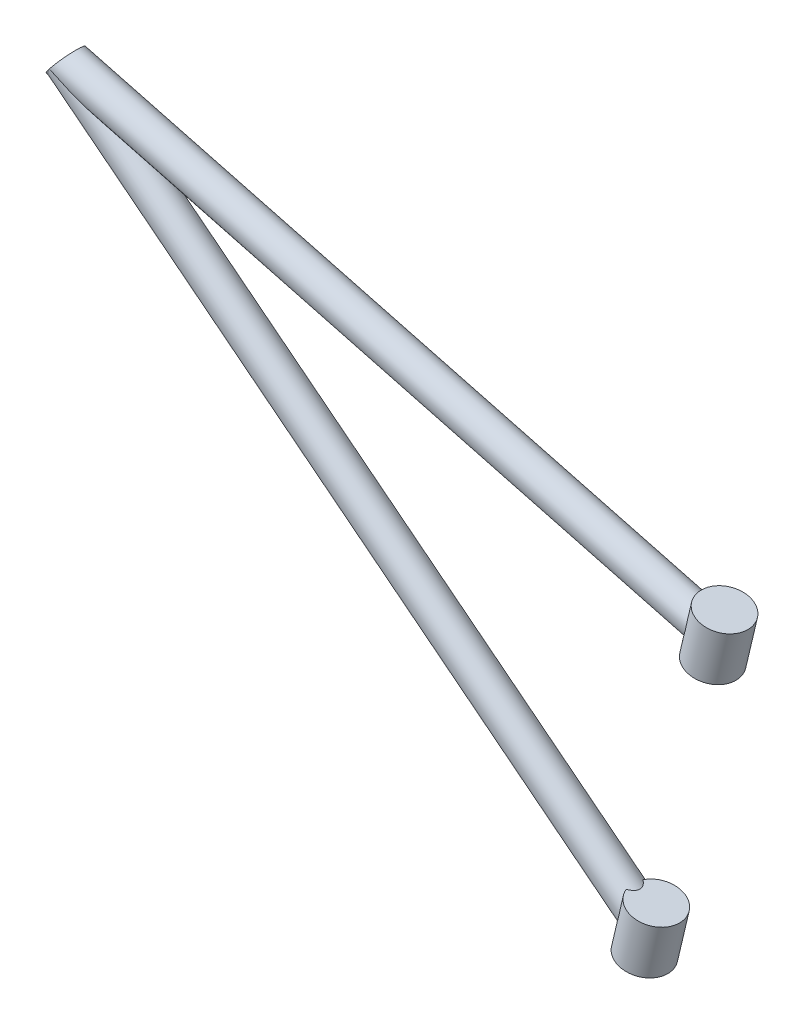
ISO-10303-21;
HEADER;
FILE_DESCRIPTION(('STEP AP214'),'2;1');
FILE_NAME('part.step','',(''),(''),'','','');
FILE_SCHEMA(('AUTOMOTIVE_DESIGN { 1 0 10303 214 1 1 1 1 }'));
ENDSEC;
DATA;
#1=APPLICATION_CONTEXT('core data for automotive mechanical design processes');
#2=APPLICATION_PROTOCOL_DEFINITION('international standard','automotive_design',2000,#1);
#3=PRODUCT_CONTEXT('',#1,'mechanical');
#4=PRODUCT('Part','Part','',(#3));
#5=PRODUCT_RELATED_PRODUCT_CATEGORY('part','',(#4));
#6=PRODUCT_DEFINITION_FORMATION('','',#4);
#7=PRODUCT_DEFINITION_CONTEXT('part definition',#1,'design');
#8=PRODUCT_DEFINITION('design','',#6,#7);
#9=PRODUCT_DEFINITION_SHAPE('','',#8);
#10=(LENGTH_UNIT() NAMED_UNIT(*) SI_UNIT(.MILLI.,.METRE.));
#11=(NAMED_UNIT(*) PLANE_ANGLE_UNIT() SI_UNIT($,.RADIAN.));
#12=(NAMED_UNIT(*) SI_UNIT($,.STERADIAN.) SOLID_ANGLE_UNIT());
#13=UNCERTAINTY_MEASURE_WITH_UNIT(LENGTH_MEASURE(1.E-05),#10,'distance_accuracy_value','');
#14=(GEOMETRIC_REPRESENTATION_CONTEXT(3) GLOBAL_UNCERTAINTY_ASSIGNED_CONTEXT((#13)) GLOBAL_UNIT_ASSIGNED_CONTEXT((#10,
#11,#12)) REPRESENTATION_CONTEXT('',''));
#15=CARTESIAN_POINT('',(0.,0.,0.));
#16=DIRECTION('',(0.,0.,1.));
#17=DIRECTION('',(1.,0.,0.));
#18=AXIS2_PLACEMENT_3D('',#15,#16,#17);
#19=CARTESIAN_POINT('',(-215.,1151.6011,-53.649));
#20=DIRECTION('',(-0.788508643665139,0.615015858971912,-0.00310033520835739));
#21=DIRECTION('',(-0.615018814783549,-0.788512433295911,0.));
#22=AXIS2_PLACEMENT_3D('',#19,#20,#21);
#23=CYLINDRICAL_SURFACE('',#22,9.525);
#24=CARTESIAN_POINT('',(-243.39562055654,1173.74893199642,-53.7606486710474));
#25=DIRECTION('',(0.230684760062267,0.973028498209276,0.000288353283411398));
#26=DIRECTION('',(-0.973022198051878,0.230684316193179,-0.00354236655039736));
#27=AXIS2_PLACEMENT_3D('',#24,#25,#26);
#28=ELLIPSE('',#27,22.8674930535986,9.525);
#29=CARTESIAN_POINT('',(-224.286262085042,1169.21993073521,-58.5827833271125));
#30=VERTEX_POINT('',#29);
#31=CARTESIAN_POINT('',(-224.320634321341,1169.225180437,-48.7995007985225));
#32=VERTEX_POINT('',#31);
#33=EDGE_CURVE('E80',#30,#32,#28,.F.);
#34=ORIENTED_EDGE('',*,*,#33,.F.);
#35=CARTESIAN_POINT('',(-224.320634321341,1169.225180437,-48.7995007985225));
#36=CARTESIAN_POINT('',(-224.295289207423,1169.09059523989,-48.6485355594731));
#37=CARTESIAN_POINT('',(-224.269502594691,1168.95160987775,-48.5016369115154));
#38=CARTESIAN_POINT('',(-224.217460516379,1168.66584174725,-48.2158483730908));
#39=CARTESIAN_POINT('',(-224.191205277724,1168.51906268832,-48.0769547371071));
#40=CARTESIAN_POINT('',(-224.138667081962,1168.21887651433,-47.8071750004393));
#41=CARTESIAN_POINT('',(-224.112384280659,1168.06548298792,-47.6762737035536));
#42=CARTESIAN_POINT('',(-224.060117173359,1167.75254967428,-47.4219621247782));
#43=CARTESIAN_POINT('',(-224.034132907183,1167.59300907918,-47.298552833037));
#44=CARTESIAN_POINT('',(-223.957136973827,1167.10586534488,-46.9390216085571));
#45=CARTESIAN_POINT('',(-223.907125055243,1166.76998067498,-46.713809774104));
#46=CARTESIAN_POINT('',(-223.81276926608,1166.08036007492,-46.2910710180656));
#47=CARTESIAN_POINT('',(-223.768428441769,1165.72661469185,-46.0935589701565));
#48=CARTESIAN_POINT('',(-223.692482337151,1165.03900047878,-45.7430462401006));
#49=CARTESIAN_POINT('',(-223.660064521758,1164.70646741956,-45.5875949874824));
#50=CARTESIAN_POINT('',(-223.605247829181,1164.03125571281,-45.2985848887143));
#51=CARTESIAN_POINT('',(-223.582847710299,1163.68857832828,-45.1650233306261));
#52=CARTESIAN_POINT('',(-223.551264109419,1162.99483116172,-44.9203286610457));
#53=CARTESIAN_POINT('',(-223.542073917122,1162.64376573279,-44.8091841869413));
#54=CARTESIAN_POINT('',(-223.540654640744,1161.93511851939,-44.6105914566239));
#55=CARTESIAN_POINT('',(-223.548419527181,1161.57753909623,-44.5231347890997));
#56=CARTESIAN_POINT('',(-223.591728976539,1160.73355915383,-44.3483048364498));
#57=CARTESIAN_POINT('',(-223.635922136758,1160.2452175784,-44.2713397563707));
#58=CARTESIAN_POINT('',(-223.739698948793,1159.51439261035,-44.1973134032289));
#59=CARTESIAN_POINT('',(-223.780506030959,1159.27120005024,-44.1795398917238));
#60=CARTESIAN_POINT('',(-223.875854045727,1158.78678991507,-44.1590549988136));
#61=CARTESIAN_POINT('',(-223.930395042434,1158.54557234923,-44.1563436877163));
#62=CARTESIAN_POINT('',(-224.054871038112,1158.06405215677,-44.1673837542468));
#63=CARTESIAN_POINT('',(-224.12500107534,1157.82380433931,-44.181354500947));
#64=CARTESIAN_POINT('',(-224.280401330248,1157.34999089194,-44.2273617054836));
#65=CARTESIAN_POINT('',(-224.365670871451,1157.11642496401,-44.2593973562663));
#66=CARTESIAN_POINT('',(-224.550567614918,1156.65864283163,-44.3423936701185));
#67=CARTESIAN_POINT('',(-224.650187433858,1156.43442189516,-44.3933446222576));
#68=CARTESIAN_POINT('',(-224.86212569037,1155.99750936304,-44.5145483765032));
#69=CARTESIAN_POINT('',(-224.974442851189,1155.78481661139,-44.5847992389658));
#70=CARTESIAN_POINT('',(-225.191087424431,1155.40463409945,-44.7320466579948));
#71=CARTESIAN_POINT('',(-225.293959076843,1155.23524453879,-44.80631437343));
#72=CARTESIAN_POINT('',(-225.50528074953,1154.9065164519,-44.9681794158287));
#73=CARTESIAN_POINT('',(-225.613732938815,1154.74718188818,-45.0557819519947));
#74=CARTESIAN_POINT('',(-225.834357534689,1154.43893292305,-45.2438062320331));
#75=CARTESIAN_POINT('',(-225.946531105204,1154.29002182791,-45.3442320151155));
#76=CARTESIAN_POINT('',(-226.172751379729,1154.00271207689,-45.5572829491347));
#77=CARTESIAN_POINT('',(-226.286798308782,1153.8643146954,-45.6699095749595));
#78=CARTESIAN_POINT('',(-226.521059223594,1153.59087193904,-45.912967181198));
#79=CARTESIAN_POINT('',(-226.641280572878,1153.45639033468,-46.0440245602015));
#80=CARTESIAN_POINT('',(-226.880011711337,1153.19866386453,-46.3181683650363));
#81=CARTESIAN_POINT('',(-226.998521482131,1153.07541911934,-46.4612549199345));
#82=CARTESIAN_POINT('',(-227.232179016608,1152.8397918452,-46.7587406524558));
#83=CARTESIAN_POINT('',(-227.347325968949,1152.72741192273,-46.9131425290829));
#84=CARTESIAN_POINT('',(-227.57271586912,1152.51320348435,-47.2324871004078));
#85=CARTESIAN_POINT('',(-227.682958494457,1152.41137566175,-47.3974304865487));
#86=CARTESIAN_POINT('',(-227.91478883551,1152.2020582696,-47.7650609369957));
#87=CARTESIAN_POINT('',(-228.035261038146,1152.0963912512,-47.9694943631884));
#88=CARTESIAN_POINT('',(-228.265752160391,1151.89856614401,-48.3904502736869));
#89=CARTESIAN_POINT('',(-228.375770122552,1151.80640929212,-48.6069738623902));
#90=CARTESIAN_POINT('',(-228.583652833395,1151.63530590534,-49.0509046031115));
#91=CARTESIAN_POINT('',(-228.681513852451,1151.55636342192,-49.2783150656136));
#92=CARTESIAN_POINT('',(-228.863515556458,1151.41154684608,-49.7425923124705));
#93=CARTESIAN_POINT('',(-228.947656277923,1151.3456727189,-49.9794590716571));
#94=CARTESIAN_POINT('',(-229.104160202246,1151.22436656883,-50.4714355906892));
#95=CARTESIAN_POINT('',(-229.175870386422,1151.16949773997,-50.7268927878857));
#96=CARTESIAN_POINT('',(-229.30170568039,1151.07381374639,-51.2446931910341));
#97=CARTESIAN_POINT('',(-229.355830136662,1151.03299910395,-51.507036652501));
#98=CARTESIAN_POINT('',(-229.445529959469,1150.96543066709,-52.0366091980168));
#99=CARTESIAN_POINT('',(-229.481109122684,1150.93867399466,-52.3038372704605));
#100=CARTESIAN_POINT('',(-229.533094783594,1150.89922397472,-52.841176424877));
#101=CARTESIAN_POINT('',(-229.549502067782,1150.88653005032,-53.1112873881254));
#102=CARTESIAN_POINT('',(-229.562602852696,1150.87542087448,-53.6424212189688));
#103=CARTESIAN_POINT('',(-229.55999265743,1150.87650236565,-53.9034167434214));
#104=CARTESIAN_POINT('',(-229.536731293886,1150.89173055095,-54.4242151822462));
#105=CARTESIAN_POINT('',(-229.516080545401,1150.90587694106,-54.6840181242275));
#106=CARTESIAN_POINT('',(-229.457074051506,1150.94722348577,-55.2005289023706));
#107=CARTESIAN_POINT('',(-229.418719841866,1150.97442250805,-55.4572370050269));
#108=CARTESIAN_POINT('',(-229.324926596394,1151.04186428499,-55.9657687486384));
#109=CARTESIAN_POINT('',(-229.269487466396,1151.08210711153,-56.2175923626644));
#110=CARTESIAN_POINT('',(-229.142935316919,1151.17525683397,-56.7125894774502));
#111=CARTESIAN_POINT('',(-229.071954994863,1151.22805682198,-56.9558170972995));
#112=CARTESIAN_POINT('',(-228.915166201555,1151.34653272991,-57.4342155058911));
#113=CARTESIAN_POINT('',(-228.829357822413,1151.41220856983,-57.6693863446706));
#114=CARTESIAN_POINT('',(-228.644188865129,1151.55656830355,-58.1303353799106));
#115=CARTESIAN_POINT('',(-228.544822192596,1151.63525805041,-58.3561092925963));
#116=CARTESIAN_POINT('',(-228.334087726109,1151.80580566917,-58.7968231124242));
#117=CARTESIAN_POINT('',(-228.222719654651,1151.89766384557,-59.0117627688809));
#118=CARTESIAN_POINT('',(-227.985290757245,1152.09856074262,-59.4374765664712));
#119=CARTESIAN_POINT('',(-227.858833402729,1152.20811807729,-59.6477852583267));
#120=CARTESIAN_POINT('',(-227.597000050461,1152.44215985744,-60.054091947955));
#121=CARTESIAN_POINT('',(-227.461623346321,1152.56664548585,-60.2500888096738));
#122=CARTESIAN_POINT('',(-227.184445881784,1152.83104256014,-60.6264138271711));
#123=CARTESIAN_POINT('',(-227.042647077319,1152.97094932768,-60.8067467054395));
#124=CARTESIAN_POINT('',(-226.755363006274,1153.26681642774,-61.1505013351463));
#125=CARTESIAN_POINT('',(-226.609878432523,1153.42277375979,-61.3139262359179));
#126=CARTESIAN_POINT('',(-226.342824344719,1153.72371503972,-61.5966577360825));
#127=CARTESIAN_POINT('',(-226.221339018976,1153.86614781129,-61.7187655348228));
#128=CARTESIAN_POINT('',(-225.979981444149,1154.16271310562,-61.9496161814568));
#129=CARTESIAN_POINT('',(-225.860108896456,1154.31684342644,-62.0583615346306));
#130=CARTESIAN_POINT('',(-225.624229262011,1154.63663394021,-62.2616660803098));
#131=CARTESIAN_POINT('',(-225.508217755384,1154.80228022846,-62.3562419603986));
#132=CARTESIAN_POINT('',(-225.282089586541,1155.14495226779,-62.5307434214336));
#133=CARTESIAN_POINT('',(-225.17197291344,1155.32197799786,-62.6106690294297));
#134=CARTESIAN_POINT('',(-224.959190023712,1155.68761446855,-62.7557996087947));
#135=CARTESIAN_POINT('',(-224.856564468665,1155.87627946014,-62.8209277883119));
#136=CARTESIAN_POINT('',(-224.661237833143,1156.26318881536,-62.9357724147125));
#137=CARTESIAN_POINT('',(-224.568536377274,1156.46143281624,-62.9854894446814));
#138=CARTESIAN_POINT('',(-224.394434085732,1156.86594068026,-63.0696863707433));
#139=CARTESIAN_POINT('',(-224.313032947956,1157.07220432882,-63.1041666742283));
#140=CARTESIAN_POINT('',(-224.162300581922,1157.49097492688,-63.1584073059781));
#141=CARTESIAN_POINT('',(-224.092970598108,1157.70348251746,-63.1781661172562));
#142=CARTESIAN_POINT('',(-223.957854047408,1158.16246560266,-63.2055004800131));
#143=CARTESIAN_POINT('',(-223.893867153004,1158.40959214042,-63.2110259573232));
#144=CARTESIAN_POINT('',(-223.781156826037,1158.90708309515,-63.2054279177171));
#145=CARTESIAN_POINT('',(-223.732435891857,1159.15744803513,-63.1943016773491));
#146=CARTESIAN_POINT('',(-223.648963411181,1159.65993837552,-63.1568028848643));
#147=CARTESIAN_POINT('',(-223.614245946277,1159.91206656964,-63.1303935121607));
#148=CARTESIAN_POINT('',(-223.557424839203,1160.4159253131,-63.0636288551156));
#149=CARTESIAN_POINT('',(-223.535325708187,1160.6676556882,-63.0232685914876));
#150=CARTESIAN_POINT('',(-223.493975928202,1161.29297924496,-62.9067113291572));
#151=CARTESIAN_POINT('',(-223.481481689577,1161.66556564527,-62.8226533010995));
#152=CARTESIAN_POINT('',(-223.475960464991,1162.40411320297,-62.6287679695519));
#153=CARTESIAN_POINT('',(-223.48294217018,1162.77007132916,-62.5189291814144));
#154=CARTESIAN_POINT('',(-223.51200981016,1163.49347214513,-62.2750042212048));
#155=CARTESIAN_POINT('',(-223.534107506928,1163.8509079793,-62.1408992270475));
#156=CARTESIAN_POINT('',(-223.589746146211,1164.55514036599,-61.8491637111948));
#157=CARTESIAN_POINT('',(-223.62328825752,1164.90193582789,-61.6915307875696));
#158=CARTESIAN_POINT('',(-223.702279469123,1165.61509098963,-61.3366418506304));
#159=CARTESIAN_POINT('',(-223.748554703177,1165.98019871388,-61.137048340388));
#160=CARTESIAN_POINT('',(-223.847550102805,1166.69187765871,-60.7087468537214));
#161=CARTESIAN_POINT('',(-223.900266593298,1167.03845928863,-60.4800554761369));
#162=CARTESIAN_POINT('',(-223.981669040053,1167.54070544438,-60.1143525560349));
#163=CARTESIAN_POINT('',(-224.009158447193,1167.70500562439,-59.9888300636568));
#164=CARTESIAN_POINT('',(-224.064536974263,1168.02720420642,-59.7299166212185));
#165=CARTESIAN_POINT('',(-224.092426037216,1168.1851035089,-59.5965267844526));
#166=CARTESIAN_POINT('',(-224.14825641266,1168.49402051598,-59.3213551888889));
#167=CARTESIAN_POINT('',(-224.176197714492,1168.64502338139,-59.179556716037));
#168=CARTESIAN_POINT('',(-224.231658194301,1168.93887124126,-58.8875319299619));
#169=CARTESIAN_POINT('',(-224.259177152742,1169.08171209155,-58.7373014108564));
#170=CARTESIAN_POINT('',(-224.286262085042,1169.21993073521,-58.5827833271127));
#171=B_SPLINE_CURVE_WITH_KNOTS('',3,(#35,#36,#37,#38,#39,#40,#41,#42,#43,#44,#45,#46,#47,#48,
#49,#50,#51,#52,#53,#54,#55,#56,#57,#58,#59,#60,#61,#62,#63,#64,#65,#66,#67,#68,#69,#70,#71,#72,
#73,#74,#75,#76,#77,#78,#79,#80,#81,#82,#83,#84,#85,#86,#87,#88,#89,#90,#91,#92,#93,#94,#95,#96,
#97,#98,#99,#100,#101,#102,#103,#104,#105,#106,#107,#108,#109,#110,#111,#112,#113,#114,#115,
#116,#117,#118,#119,#120,#121,#122,#123,#124,#125,#126,#127,#128,#129,#130,#131,#132,#133,#134,
#135,#136,#137,#138,#139,#140,#141,#142,#143,#144,#145,#146,#147,#148,#149,#150,#151,#152,#153,
#154,#155,#156,#157,#158,#159,#160,#161,#162,#163,#164,#165,#166,#167,#168,#169,#170),
.UNSPECIFIED.,.F.,.F.,(4,2,2,2,2,2,2,2,2,2,2,2,2,2,2,2,2,2,2,2,2,2,2,2,2,2,2,2,2,2,2,2,2,2,2,2,
2,2,2,2,2,2,2,2,2,2,2,2,2,2,2,2,2,2,2,2,2,2,2,2,2,2,2,2,2,2,2,4),(0.,0.611321113095376,
1.22235382943905,1.83218605530833,2.44209870234837,3.66289333627039,4.88434099855855,
5.98894252437587,7.09340709627885,8.19731043031255,9.3008212635092,10.7844934193154,
11.5255072719039,12.2665245834172,13.0173945439191,13.768230961792,14.5186824394653,
15.2690585242177,15.9032452299517,16.5376803173906,17.1723157415739,17.8070279688856,
18.4752867183987,19.1435526389086,19.8119784806388,20.4804482111198,21.258843318667,
22.0373096468022,22.8160142137426,23.5947167082833,24.4065344178047,25.2183822925516,
26.0300638965936,26.8417122016529,27.6237962912563,28.4058621827748,29.187860243073,
29.9698626134919,30.7454316380735,31.5209958450602,32.2969098201376,33.0728417402573,
33.8781372588605,34.68349663142,35.48861234955,36.2935778332745,36.9634458938148,
37.6331881707952,38.3021353757178,38.9710813454979,39.6434233396011,40.3157398923393,
40.9880384679274,41.6604063114264,42.4252747618273,43.1902683230497,43.9571126486431,
44.7242309558051,45.8689446439775,47.0141692429462,48.1602859732013,49.3065197888623,
50.5611680159512,51.8151037127785,52.4406454213905,53.066098822063,53.6928400783569,
54.319896778774),.UNSPECIFIED.);
#172=EDGE_CURVE('E86',#32,#30,#171,.T.);
#173=ORIENTED_EDGE('',*,*,#172,.F.);
#174=EDGE_LOOP('',(#34,#173));
#175=FACE_BOUND('',#174,.T.);
#176=CARTESIAN_POINT('',(-558.599999999999,1419.6,-55.));
#177=DIRECTION('',(-0.897008226583714,0.442000857679935,-0.00338869463695132));
#178=DIRECTION('',(0.441999884452041,0.897014466927656,0.00107157215105032));
#179=AXIS2_PLACEMENT_3D('',#176,#177,#178);
#180=ELLIPSE('',#179,9.72785711197768,9.525);
#181=CARTESIAN_POINT('',(-558.566535399132,1419.59488894593,-64.5249398422045));
#182=VERTEX_POINT('',#181);
#183=CARTESIAN_POINT('',(-558.633464600869,1419.60511105407,-45.4750601577955));
#184=VERTEX_POINT('',#183);
#185=EDGE_CURVE('E93',#182,#184,#180,.T.);
#186=ORIENTED_EDGE('',*,*,#185,.F.);
#187=CARTESIAN_POINT('',(-558.599999999999,1419.6,-55.));
#188=DIRECTION('',(0.441999884452041,0.897014466927656,0.00107157215105032));
#189=DIRECTION('',(-0.897008226583714,0.442000857679935,-0.00338869463695132));
#190=AXIS2_PLACEMENT_3D('',#187,#188,#189);
#191=ELLIPSE('',#190,46.8855974220386,9.525);
#192=EDGE_CURVE('E119',#184,#182,#191,.T.);
#193=ORIENTED_EDGE('',*,*,#192,.F.);
#194=EDGE_LOOP('',(#186,#193));
#195=FACE_BOUND('',#194,.T.);
#196=ADVANCED_FACE('F67',(#175,#195),#23,.T.);
#197=CARTESIAN_POINT('',(-175.,1320.3211,-53.599));
#198=DIRECTION('',(-0.968096795715719,0.250551577091192,-0.00353572369863849));
#199=DIRECTION('',(-0.250553143221362,-0.968102847027058,0.));
#200=AXIS2_PLACEMENT_3D('',#197,#198,#199);
#201=CYLINDRICAL_SURFACE('',#200,9.525);
#202=CARTESIAN_POINT('',(-190.753939195461,1314.55952101737,-53.6478210535175));
#203=CARTESIAN_POINT('',(-190.753173276137,1314.55932352662,-53.8874819712135));
#204=CARTESIAN_POINT('',(-190.744347125622,1314.56639484963,-54.127133975741));
#205=CARTESIAN_POINT('',(-190.71075571716,1314.59498073899,-54.6044527277699));
#206=CARTESIAN_POINT('',(-190.685989540937,1314.61649613745,-54.8421193600982));
#207=CARTESIAN_POINT('',(-190.621032728392,1314.67370023612,-55.3137218601182));
#208=CARTESIAN_POINT('',(-190.580834245694,1314.70939614656,-55.547655766826));
#209=CARTESIAN_POINT('',(-190.48584676052,1314.79452200271,-56.0099791079303));
#210=CARTESIAN_POINT('',(-190.431057771031,1314.8439519362,-56.2383685472621));
#211=CARTESIAN_POINT('',(-190.308254983543,1314.95573315487,-56.6870713684654));
#212=CARTESIAN_POINT('',(-190.24030531069,1315.01802187907,-56.9074179891311));
#213=CARTESIAN_POINT('',(-190.092242541731,1315.1550712723,-57.3399734740079));
#214=CARTESIAN_POINT('',(-190.012129472565,1315.22983191371,-57.5521823562414));
#215=CARTESIAN_POINT('',(-189.84108895378,1315.39121656418,-57.9674608202499));
#216=CARTESIAN_POINT('',(-189.750163613113,1315.47783826022,-58.1705321736977));
#217=CARTESIAN_POINT('',(-189.558844298662,1315.66243521111,-58.5668985191001));
#218=CARTESIAN_POINT('',(-189.458446804482,1315.76041469027,-58.7601898349033));
#219=CARTESIAN_POINT('',(-189.240922696546,1315.97584539456,-59.1520214270591));
#220=CARTESIAN_POINT('',(-189.123099194351,1316.09423887925,-59.3496565831249));
#221=CARTESIAN_POINT('',(-188.879812171168,1316.34332315267,-59.7321832057202));
#222=CARTESIAN_POINT('',(-188.754345350303,1316.47401926633,-59.9170690934688));
#223=CARTESIAN_POINT('',(-188.497479795171,1316.74752979453,-60.2737962759467));
#224=CARTESIAN_POINT('',(-188.366072973456,1316.89036097895,-60.4456188761465));
#225=CARTESIAN_POINT('',(-188.099439552992,1317.18775611879,-60.7754449671732));
#226=CARTESIAN_POINT('',(-187.964214216859,1317.34231622385,-60.9334529567109));
#227=CARTESIAN_POINT('',(-187.670667191836,1317.68818460187,-61.2587751225514));
#228=CARTESIAN_POINT('',(-187.512026137735,1317.88146851752,-61.4237108335926));
#229=CARTESIAN_POINT('',(-187.195476461372,1318.28397071489,-61.7338255596395));
#230=CARTESIAN_POINT('',(-187.037568021286,1318.49319275592,-61.8789998908875));
#231=CARTESIAN_POINT('',(-186.726467155519,1318.92743566851,-62.148229603562));
#232=CARTESIAN_POINT('',(-186.573266845149,1319.15242779309,-62.2723220696339));
#233=CARTESIAN_POINT('',(-186.27538978657,1319.61876958345,-62.4983197574415));
#234=CARTESIAN_POINT('',(-186.130713066173,1319.8601193026,-62.600224906784));
#235=CARTESIAN_POINT('',(-185.8961508264,1320.28357772402,-62.7530015433697));
#236=CARTESIAN_POINT('',(-185.802890326575,1320.46162664385,-62.8099984758332));
#237=CARTESIAN_POINT('',(-185.624452256442,1320.82503024277,-62.9116802923861));
#238=CARTESIAN_POINT('',(-185.539269476336,1321.01038010234,-62.9563731479945));
#239=CARTESIAN_POINT('',(-185.378603479192,1321.38753946652,-63.0328474108784));
#240=CARTESIAN_POINT('',(-185.303107246393,1321.57933985649,-63.0646462706239));
#241=CARTESIAN_POINT('',(-185.163043472864,1321.96861509383,-63.1149416436986));
#242=CARTESIAN_POINT('',(-185.09847605389,1322.16609000438,-63.1334380088355));
#243=CARTESIAN_POINT('',(-184.981065993868,1322.56611441825,-63.1568806882635));
#244=CARTESIAN_POINT('',(-184.928268998185,1322.76868039991,-63.1617750672427));
#245=CARTESIAN_POINT('',(-184.835256243172,1323.17653970493,-63.1578218281094));
#246=CARTESIAN_POINT('',(-184.795040260688,1323.38183297984,-63.148974453756));
#247=CARTESIAN_POINT('',(-184.727144716963,1323.79366202198,-63.1177400358333));
#248=CARTESIAN_POINT('',(-184.69947794484,1324.00019884036,-63.0953392337324));
#249=CARTESIAN_POINT('',(-184.656210799934,1324.41270806028,-63.0374228992829));
#250=CARTESIAN_POINT('',(-184.640612905695,1324.61868033724,-63.0019046752663));
#251=CARTESIAN_POINT('',(-184.618751170142,1325.06579843923,-62.9107435297436));
#252=CARTESIAN_POINT('',(-184.614693912215,1325.3065467072,-62.8526186902304));
#253=CARTESIAN_POINT('',(-184.620178123392,1325.78329016911,-62.7199128906776));
#254=CARTESIAN_POINT('',(-184.629722539503,1326.01928432177,-62.6453283673611));
#255=CARTESIAN_POINT('',(-184.660255999537,1326.48527926654,-62.4806248191313));
#256=CARTESIAN_POINT('',(-184.681257098936,1326.71527347752,-62.3904894990802));
#257=CARTESIAN_POINT('',(-184.732559890817,1327.16784350322,-62.1956367216974));
#258=CARTESIAN_POINT('',(-184.762861319196,1327.39041952841,-62.0909196784936));
#259=CARTESIAN_POINT('',(-184.865911822417,1328.05385985535,-61.7518083902875));
#260=CARTESIAN_POINT('',(-184.950111250602,1328.48194494949,-61.4954738528022));
#261=CARTESIAN_POINT('',(-185.133822788399,1329.29758942415,-60.9292388650454));
#262=CARTESIAN_POINT('',(-185.233342425093,1329.68512872577,-60.6193120747022));
#263=CARTESIAN_POINT('',(-185.396286649879,1330.27137728801,-60.0788218089472));
#264=CARTESIAN_POINT('',(-185.458754556981,1330.4850666954,-59.8640425597593));
#265=CARTESIAN_POINT('',(-185.582426558913,1330.89268542503,-59.4159634068953));
#266=CARTESIAN_POINT('',(-185.643630396179,1331.08661075126,-59.1826597747452));
#267=CARTESIAN_POINT('',(-185.762335459443,1331.45218421076,-58.6986784073366));
#268=CARTESIAN_POINT('',(-185.819840326108,1331.62385442277,-58.4480182757927));
#269=CARTESIAN_POINT('',(-185.928984648582,1331.94260903194,-57.9303515724569));
#270=CARTESIAN_POINT('',(-185.980626347743,1332.08970284269,-57.6633513132824));
#271=CARTESIAN_POINT('',(-186.064147843548,1332.32356572651,-57.1828384878096));
#272=CARTESIAN_POINT('',(-186.097752101616,1332.41624778731,-56.9724868639357));
#273=CARTESIAN_POINT('',(-186.159676195115,1332.58513618912,-56.5445323049793));
#274=CARTESIAN_POINT('',(-186.187997152762,1332.66134602951,-56.3269309214038));
#275=CARTESIAN_POINT('',(-186.238627519419,1332.79622533821,-55.8858360715992));
#276=CARTESIAN_POINT('',(-186.260941253334,1332.85490742899,-55.662346972188));
#277=CARTESIAN_POINT('',(-186.299000364562,1332.95393421736,-55.2107718407871));
#278=CARTESIAN_POINT('',(-186.314745578389,1332.99427845854,-54.9826856945277));
#279=CARTESIAN_POINT('',(-186.339285132057,1333.05608805207,-54.5227632708627));
#280=CARTESIAN_POINT('',(-186.348054615067,1333.07748592261,-54.2909165601384));
#281=CARTESIAN_POINT('',(-186.358312459469,1333.10079576062,-53.82608160722));
#282=CARTESIAN_POINT('',(-186.359800830609,1333.10270775418,-53.593093366555));
#283=CARTESIAN_POINT('',(-186.355470246828,1333.08701359718,-53.1278233888262));
#284=CARTESIAN_POINT('',(-186.349650556795,1333.06940548314,-52.8955417251923));
#285=CARTESIAN_POINT('',(-186.33088876191,1333.01496921863,-52.4335435709002));
#286=CARTESIAN_POINT('',(-186.31794682275,1332.97814151529,-52.2038270206933));
#287=CARTESIAN_POINT('',(-186.286194495221,1332.88832829191,-51.760774671337));
#288=CARTESIAN_POINT('',(-186.267732647408,1332.83630579613,-51.5472172471947));
#289=CARTESIAN_POINT('',(-186.225230658051,1332.71626929353,-51.1251439688765));
#290=CARTESIAN_POINT('',(-186.201188587855,1332.64824975766,-50.9166298853708));
#291=CARTESIAN_POINT('',(-186.14811517242,1332.49710320011,-50.5058861719436));
#292=CARTESIAN_POINT('',(-186.119085164448,1332.41398022732,-50.3036548747222));
#293=CARTESIAN_POINT('',(-186.056683514999,1332.23351841698,-49.9062611522535));
#294=CARTESIAN_POINT('',(-186.023310282131,1332.1361743671,-49.7111013517311));
#295=CARTESIAN_POINT('',(-185.94999474642,1331.91950850595,-49.31256926022));
#296=CARTESIAN_POINT('',(-185.90973605236,1331.79902700764,-49.1098859830114));
#297=CARTESIAN_POINT('',(-185.825943032636,1331.54367220568,-48.7144141817806));
#298=CARTESIAN_POINT('',(-185.782407331804,1331.40879285005,-48.5216298695031));
#299=CARTESIAN_POINT('',(-185.693090061034,1331.12577289579,-48.1465066033552));
#300=CARTESIAN_POINT('',(-185.647307670951,1330.9776274379,-47.9641715173833));
#301=CARTESIAN_POINT('',(-185.554587160773,1330.66915883348,-47.6104135050218));
#302=CARTESIAN_POINT('',(-185.507648909479,1330.50883430017,-47.4389918253873));
#303=CARTESIAN_POINT('',(-185.405529917009,1330.14791834102,-47.0783761657935));
#304=CARTESIAN_POINT('',(-185.350343687659,1329.94518910973,-46.8913190550529));
#305=CARTESIAN_POINT('',(-185.241881973975,1329.52557208121,-46.5331748294722));
#306=CARTESIAN_POINT('',(-185.188606785969,1329.30868210278,-46.3620901848025));
#307=CARTESIAN_POINT('',(-185.086072541563,1328.86182620662,-46.0363044005713));
#308=CARTESIAN_POINT('',(-185.036815828541,1328.63185279007,-45.8816128051318));
#309=CARTESIAN_POINT('',(-184.944722130874,1328.16006584648,-45.5893457115036));
#310=CARTESIAN_POINT('',(-184.901884218953,1327.91825403634,-45.4517677415229));
#311=CARTESIAN_POINT('',(-184.830045775968,1327.4547018407,-45.2105447246641));
#312=CARTESIAN_POINT('',(-184.799986241843,1327.23421384418,-45.1048075479443));
#313=CARTESIAN_POINT('',(-184.748774030131,1326.78584712572,-44.9077432078227));
#314=CARTESIAN_POINT('',(-184.727621306168,1326.55796844227,-44.8164159693926));
#315=CARTESIAN_POINT('',(-184.696347198844,1326.09626942506,-44.6491714394377));
#316=CARTESIAN_POINT('',(-184.68620802866,1325.86245929749,-44.573229462681));
#317=CARTESIAN_POINT('',(-184.67903132957,1325.38996819197,-44.4375771914747));
#318=CARTESIAN_POINT('',(-184.681990869216,1325.15128831575,-44.3778632684163));
#319=CARTESIAN_POINT('',(-184.701113937431,1324.71315583905,-44.2846885314263));
#320=CARTESIAN_POINT('',(-184.714864220245,1324.51418526346,-44.2484577267921));
#321=CARTESIAN_POINT('',(-184.753454086789,1324.11547586847,-44.1882676646681));
#322=CARTESIAN_POINT('',(-184.778291442209,1323.91573721144,-44.1643059433826));
#323=CARTESIAN_POINT('',(-184.839575239762,1323.51707439087,-44.1290913982558));
#324=CARTESIAN_POINT('',(-184.876012305947,1323.3181497005,-44.1178283434682));
#325=CARTESIAN_POINT('',(-184.960610702788,1322.92248327026,-44.1082216390922));
#326=CARTESIAN_POINT('',(-185.0087722333,1322.72574156767,-44.1098782097471));
#327=CARTESIAN_POINT('',(-185.116448777112,1322.3359358264,-44.1261293389288));
#328=CARTESIAN_POINT('',(-185.175963949373,1322.14287183925,-44.1407240786109));
#329=CARTESIAN_POINT('',(-185.305526466112,1321.76174113289,-44.1826384041491));
#330=CARTESIAN_POINT('',(-185.375573741006,1321.57367438066,-44.2099579059361));
#331=CARTESIAN_POINT('',(-185.525107495252,1321.20339231672,-44.2769538630643));
#332=CARTESIAN_POINT('',(-185.60460312216,1321.02118289626,-44.3166423549069));
#333=CARTESIAN_POINT('',(-185.771633917045,1320.66344516805,-44.4078651697605));
#334=CARTESIAN_POINT('',(-185.859173660085,1320.48792074366,-44.4594062592457));
#335=CARTESIAN_POINT('',(-186.067552294938,1320.09342535133,-44.5906059998254));
#336=CARTESIAN_POINT('',(-186.190604764323,1319.87688487849,-44.6740750180193));
#337=CARTESIAN_POINT('',(-186.444530514028,1319.45626849778,-44.858702392554));
#338=CARTESIAN_POINT('',(-186.575406603965,1319.25219712167,-44.9598671292057));
#339=CARTESIAN_POINT('',(-186.84216519874,1318.85635167945,-45.1789295170187));
#340=CARTESIAN_POINT('',(-186.978053010163,1318.6645912736,-45.2968453046592));
#341=CARTESIAN_POINT('',(-187.252036303826,1318.29345418746,-45.5484468412848));
#342=CARTESIAN_POINT('',(-187.390131649517,1318.11407674484,-45.6821316181053));
#343=CARTESIAN_POINT('',(-187.668826468743,1317.76414398747,-45.9673274821298));
#344=CARTESIAN_POINT('',(-187.809422639033,1317.5938268329,-46.119133685765));
#345=CARTESIAN_POINT('',(-188.088158414499,1317.26570662138,-46.4378804637019));
#346=CARTESIAN_POINT('',(-188.226297392594,1317.10790672432,-46.6048248368548));
#347=CARTESIAN_POINT('',(-188.497931510532,1316.80490108163,-46.9533357011089));
#348=CARTESIAN_POINT('',(-188.631426199408,1316.65969655701,-47.13490360653));
#349=CARTESIAN_POINT('',(-188.891690618255,1316.38211379078,-47.5121778541811));
#350=CARTESIAN_POINT('',(-189.018459351595,1316.24973744763,-47.7078862816179));
#351=CARTESIAN_POINT('',(-189.279745979003,1315.98125583595,-48.1402327111003));
#352=CARTESIAN_POINT('',(-189.413000394817,1315.84705882036,-48.3788297547625));
#353=CARTESIAN_POINT('',(-189.665179366286,1315.59667697649,-48.8723600257526));
#354=CARTESIAN_POINT('',(-189.784110343366,1315.48048406993,-49.1272858535176));
#355=CARTESIAN_POINT('',(-190.004688346199,1315.26725911924,-49.6518284776941));
#356=CARTESIAN_POINT('',(-190.106355604091,1315.17020462412,-49.9214275813983));
#357=CARTESIAN_POINT('',(-190.289791434439,1314.99633830584,-50.473574235218));
#358=CARTESIAN_POINT('',(-190.371568114587,1314.91951823377,-50.7561164535332));
#359=CARTESIAN_POINT('',(-190.493594140676,1314.80528196961,-51.2532766092158));
#360=CARTESIAN_POINT('',(-190.53908902951,1314.7628311576,-51.4654743048959));
#361=CARTESIAN_POINT('',(-190.617480225738,1314.68968177169,-51.8941629273531));
#362=CARTESIAN_POINT('',(-190.650379035156,1314.65898086384,-52.1106529925198));
#363=CARTESIAN_POINT('',(-190.702969572811,1314.60966175048,-52.546501385509));
#364=CARTESIAN_POINT('',(-190.722667061322,1314.59103827521,-52.7658584197033));
#365=CARTESIAN_POINT('',(-190.748505451264,1314.56605831575,-53.2060864141235));
#366=CARTESIAN_POINT('',(-190.754645041248,1314.55970301827,-53.4269575187319));
#367=CARTESIAN_POINT('',(-190.753939195461,1314.55952101737,-53.6478210535175));
#368=B_SPLINE_CURVE_WITH_KNOTS('',3,(#202,#203,#204,#205,#206,#207,#208,#209,#210,#211,#212,
#213,#214,#215,#216,#217,#218,#219,#220,#221,#222,#223,#224,#225,#226,#227,#228,#229,#230,#231,
#232,#233,#234,#235,#236,#237,#238,#239,#240,#241,#242,#243,#244,#245,#246,#247,#248,#249,#250,
#251,#252,#253,#254,#255,#256,#257,#258,#259,#260,#261,#262,#263,#264,#265,#266,#267,#268,#269,
#270,#271,#272,#273,#274,#275,#276,#277,#278,#279,#280,#281,#282,#283,#284,#285,#286,#287,#288,
#289,#290,#291,#292,#293,#294,#295,#296,#297,#298,#299,#300,#301,#302,#303,#304,#305,#306,#307,
#308,#309,#310,#311,#312,#313,#314,#315,#316,#317,#318,#319,#320,#321,#322,#323,#324,#325,#326,
#327,#328,#329,#330,#331,#332,#333,#334,#335,#336,#337,#338,#339,#340,#341,#342,#343,#344,#345,
#346,#347,#348,#349,#350,#351,#352,#353,#354,#355,#356,#357,#358,#359,#360,#361,#362,#363,#364,
#365,#366,#367),.UNSPECIFIED.,.T.,.F.,(4,2,2,2,2,2,2,2,2,2,2,2,2,2,2,2,2,2,2,2,2,2,2,2,2,2,2,2,
2,2,2,2,2,2,2,2,2,2,2,2,2,2,2,2,2,2,2,2,2,2,2,2,2,2,2,2,2,2,2,2,2,2,2,2,2,2,2,2,2,2,2,2,2,2,2,2,
2,2,2,2,2,2,4),(0.,0.718761889194264,1.43756518875109,2.15673444055629,2.87590305219343,
3.59165189138774,4.30739914533746,5.02300701994356,5.73888191110378,6.51441922460631,
7.29029376944305,8.06725852709305,8.84396931732261,9.74155422161301,10.639351498581,
11.5355527495362,12.4317569245883,13.0579455386586,13.6837275001299,14.3086595937207,
14.9335986490664,15.5609205993016,16.1882314218648,16.8161801192703,17.4442577421181,
18.1862737774696,18.928450606119,19.6714099126252,20.4143481230415,21.9270801279758,
23.4405577502841,24.3675621714748,25.2947536497084,26.2210181283394,27.1469269985311,
27.8431599710917,28.5392448893626,29.2348273125878,29.930427047431,30.628494467083,
31.3265609519557,32.0246976601979,32.7228181275145,33.3838265046773,34.0450636825419,
34.7061238585141,35.3674269376293,36.084328300426,36.8015322001708,37.5189998886248,
38.2365493945451,39.0796230280813,39.9228268292241,40.7665188818787,41.6100889347411,
42.3485686025597,43.0870444252105,43.8243258324591,44.561442246966,45.1689467891595,
45.7763292884442,46.3832220868541,46.9901252311094,47.5970368731232,48.203944505494,
48.8114445852049,49.4192923425664,50.2061738259689,50.9933396118333,51.7813642567751,
52.5693403450419,53.3725782163624,54.176018217174,54.9795360164806,55.7831725478809,
56.6952773903345,57.6069717875684,58.517590242,59.4278368905536,60.0905809167669,
60.7531932303764,61.4155162306405,62.0779032941745),.UNSPECIFIED.);
#369=CARTESIAN_POINT('',(-190.753939195461,1314.55952101737,-53.6478210535175));
#370=VERTEX_POINT('',#369);
#371=EDGE_CURVE('E12',#370,#370,#368,.T.);
#372=ORIENTED_EDGE('',*,*,#371,.F.);
#373=EDGE_LOOP('',(#372));
#374=FACE_BOUND('',#373,.T.);
#375=CARTESIAN_POINT('',(-558.600000000001,1419.6,-55.));
#376=DIRECTION('',(-0.788508643665139,0.615015858971912,-0.00310033520835738));
#377=DIRECTION('',(-0.615013638287672,-0.788514556162628,-0.00173765353659148));
#378=AXIS2_PLACEMENT_3D('',#375,#376,#377);
#379=ELLIPSE('',#378,10.38195969076,9.525);
#380=EDGE_CURVE('E112',#182,#184,#379,.F.);
#381=ORIENTED_EDGE('',*,*,#380,.T.);
#382=ORIENTED_EDGE('',*,*,#192,.T.);
#383=EDGE_LOOP('',(#381,#382));
#384=FACE_BOUND('',#383,.T.);
#385=ADVANCED_FACE('F139',(#374,#384),#201,.T.);
#386=EDGE_CURVE('E108',#184,#182,#379,.F.);
#387=ORIENTED_EDGE('',*,*,#386,.T.);
#388=ORIENTED_EDGE('',*,*,#185,.T.);
#389=EDGE_LOOP('',(#387,#388));
#390=FACE_BOUND('',#389,.T.);
#391=ADVANCED_FACE('F142',(#390),#201,.T.);
#392=CARTESIAN_POINT('',(-558.6,1419.6,-55.));
#393=DIRECTION('',(-0.788508643665139,0.615015858971912,-0.00310033520835738));
#394=DIRECTION('',(-0.615018814783548,-0.788512433295912,0.));
#395=AXIS2_PLACEMENT_3D('',#392,#393,#394);
#396=PLANE('',#395);
#397=ORIENTED_EDGE('',*,*,#386,.F.);
#398=ORIENTED_EDGE('',*,*,#380,.F.);
#399=EDGE_LOOP('',(#397,#398));
#400=FACE_BOUND('',#399,.T.);
#401=ADVANCED_FACE('F69',(#400),#396,.T.);
#402=CARTESIAN_POINT('',(-218.460272,1137.00567,-53.6533253));
#403=DIRECTION('',(0.230684760062267,0.973028498209276,0.000288353283411398));
#404=DIRECTION('',(-0.973028538661778,0.230684769652712,0.));
#405=AXIS2_PLACEMENT_3D('',#402,#403,#404);
#406=PLANE('',#405);
#407=CARTESIAN_POINT('',(-218.460272,1137.00567,-53.6533253));
#408=DIRECTION('',(0.230684760062267,0.973028498209276,0.000288353283411398));
#409=DIRECTION('',(-0.973028538661778,0.230684769652712,0.));
#410=AXIS2_PLACEMENT_3D('',#407,#408,#409);
#411=CIRCLE('',#410,14.);
#412=CARTESIAN_POINT('',(-232.082671541265,1140.23525677514,-53.6533253));
#413=VERTEX_POINT('',#412);
#414=EDGE_CURVE('E109',#413,#413,#411,.T.);
#415=ORIENTED_EDGE('',*,*,#414,.F.);
#416=EDGE_LOOP('',(#415));
#417=FACE_BOUND('',#416,.T.);
#418=ADVANCED_FACE('F135',(#417),#406,.F.);
#419=CARTESIAN_POINT('',(-211.539728,1166.19653,-53.6446747));
#420=DIRECTION('',(0.230684760062267,0.973028498209276,0.000288353283411398));
#421=DIRECTION('',(-0.973028538661778,0.230684769652712,0.));
#422=AXIS2_PLACEMENT_3D('',#419,#420,#421);
#423=PLANE('',#422);
#424=CARTESIAN_POINT('',(-211.539728,1166.19653,-53.6446747));
#425=DIRECTION('',(0.230684760062267,0.973028498209276,0.000288353283411398));
#426=DIRECTION('',(-0.973028538661778,0.230684769652712,0.));
#427=AXIS2_PLACEMENT_3D('',#424,#425,#426);
#428=CIRCLE('',#427,14.);
#429=EDGE_CURVE('E105',#32,#30,#428,.T.);
#430=ORIENTED_EDGE('',*,*,#429,.T.);
#431=ORIENTED_EDGE('',*,*,#33,.T.);
#432=EDGE_LOOP('',(#430,#431));
#433=FACE_BOUND('',#432,.T.);
#434=ADVANCED_FACE('F107',(#433),#423,.T.);
#435=CARTESIAN_POINT('',(-218.460272,1137.00567,-53.6533253));
#436=DIRECTION('',(0.230684760062267,0.973028498209276,0.000288353283411629));
#437=DIRECTION('',(-0.973028538661778,0.230684769652712,0.));
#438=AXIS2_PLACEMENT_3D('',#435,#436,#437);
#439=CYLINDRICAL_SURFACE('',#438,14.);
#440=ORIENTED_EDGE('',*,*,#429,.F.);
#441=ORIENTED_EDGE('',*,*,#172,.T.);
#442=EDGE_LOOP('',(#440,#441));
#443=FACE_BOUND('',#442,.T.);
#444=ORIENTED_EDGE('',*,*,#414,.T.);
#445=EDGE_LOOP('',(#444));
#446=FACE_BOUND('',#445,.T.);
#447=ADVANCED_FACE('F103',(#443,#446),#439,.T.);
#448=CARTESIAN_POINT('',(-178.460272,1305.72567,-53.6033253));
#449=DIRECTION('',(0.230684760062262,0.973028498209277,0.000288353283412779));
#450=DIRECTION('',(-0.973028538661779,0.230684769652707,0.));
#451=AXIS2_PLACEMENT_3D('',#448,#449,#450);
#452=PLANE('',#451);
#453=CARTESIAN_POINT('',(-178.460272,1305.72567,-53.6033253));
#454=DIRECTION('',(0.230684760062262,0.973028498209277,0.000288353283412779));
#455=DIRECTION('',(-0.973028538661779,0.230684769652707,0.));
#456=AXIS2_PLACEMENT_3D('',#453,#454,#455);
#457=CIRCLE('',#456,14.);
#458=CARTESIAN_POINT('',(-192.082671541265,1308.95525677514,-53.6033253));
#459=VERTEX_POINT('',#458);
#460=EDGE_CURVE('E270',#459,#459,#457,.T.);
#461=ORIENTED_EDGE('',*,*,#460,.F.);
#462=EDGE_LOOP('',(#461));
#463=FACE_BOUND('',#462,.T.);
#464=ADVANCED_FACE('F131',(#463),#452,.F.);
#465=CARTESIAN_POINT('',(-171.539728,1334.91653,-53.5946747));
#466=DIRECTION('',(0.230684760062262,0.973028498209277,0.000288353283412779));
#467=DIRECTION('',(-0.973028538661779,0.230684769652707,0.));
#468=AXIS2_PLACEMENT_3D('',#465,#466,#467);
#469=PLANE('',#468);
#470=CARTESIAN_POINT('',(-171.539728,1334.91653,-53.5946747));
#471=DIRECTION('',(0.230684760062262,0.973028498209277,0.000288353283412779));
#472=DIRECTION('',(-0.973028538661779,0.230684769652707,0.));
#473=AXIS2_PLACEMENT_3D('',#470,#471,#472);
#474=CIRCLE('',#473,14.);
#475=CARTESIAN_POINT('',(-185.162127541265,1338.14611677514,-53.5946747));
#476=VERTEX_POINT('',#475);
#477=EDGE_CURVE('E115',#476,#476,#474,.T.);
#478=ORIENTED_EDGE('',*,*,#477,.T.);
#479=EDGE_LOOP('',(#478));
#480=FACE_BOUND('',#479,.T.);
#481=ADVANCED_FACE('F177',(#480),#469,.T.);
#482=CARTESIAN_POINT('',(-178.460272,1305.72567,-53.6033253));
#483=DIRECTION('',(0.230684760062265,0.973028498209276,0.000288353283411627));
#484=DIRECTION('',(-0.973028538661778,0.23068476965271,0.));
#485=AXIS2_PLACEMENT_3D('',#482,#483,#484);
#486=CYLINDRICAL_SURFACE('',#485,14.);
#487=ORIENTED_EDGE('',*,*,#371,.T.);
#488=EDGE_LOOP('',(#487));
#489=FACE_BOUND('',#488,.T.);
#490=ORIENTED_EDGE('',*,*,#477,.F.);
#491=EDGE_LOOP('',(#490));
#492=FACE_BOUND('',#491,.T.);
#493=ORIENTED_EDGE('',*,*,#460,.T.);
#494=EDGE_LOOP('',(#493));
#495=FACE_BOUND('',#494,.T.);
#496=ADVANCED_FACE('F138',(#489,#492,#495),#486,.T.);
#497=CLOSED_SHELL('',(#196,#385,#391,#401,#418,#434,#447,#464,#481,#496));
#498=MANIFOLD_SOLID_BREP('B2',#497);
#499=ADVANCED_BREP_SHAPE_REPRESENTATION('',(#18,#498),#14);
#500=SHAPE_DEFINITION_REPRESENTATION(#9,#499);
ENDSEC;
END-ISO-10303-21;
